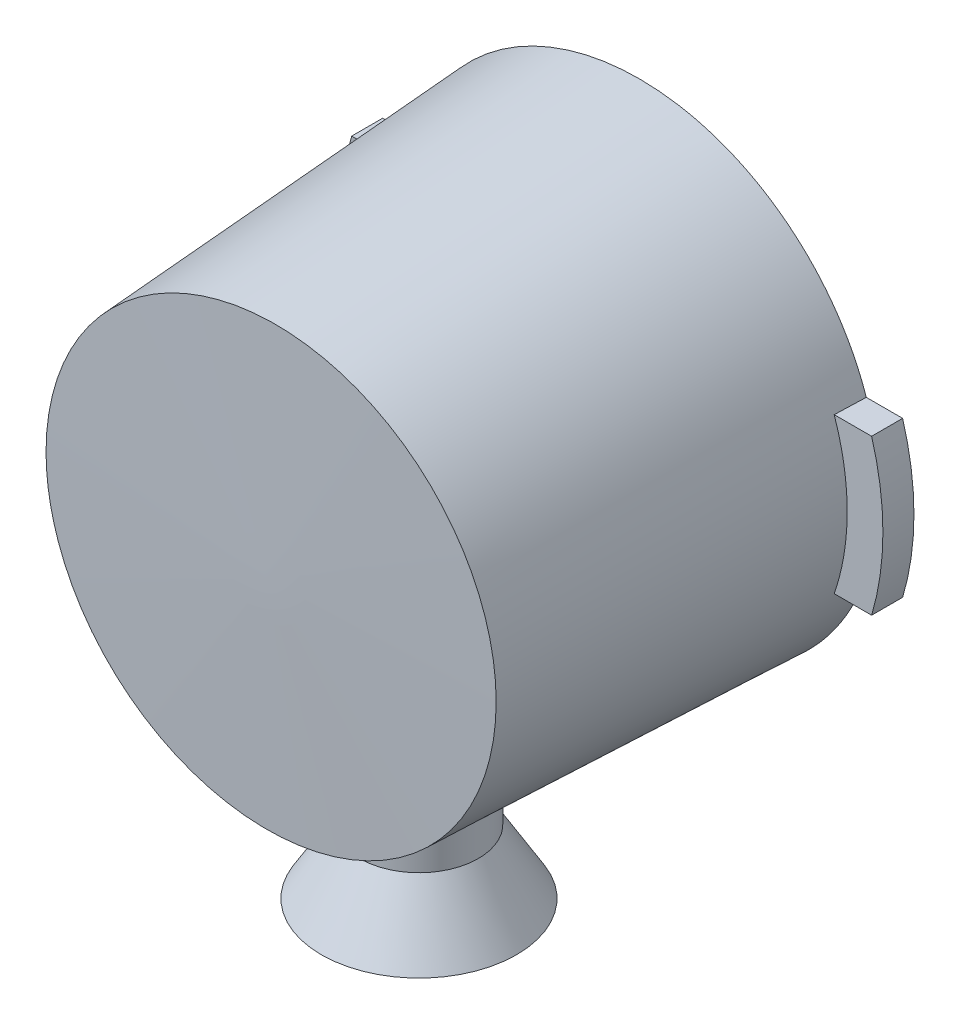
ISO-10303-21;
HEADER;
FILE_DESCRIPTION(('STEP AP214'),'2;1');
FILE_NAME('part.step','',(''),(''),'','','');
FILE_SCHEMA(('AUTOMOTIVE_DESIGN { 1 0 10303 214 1 1 1 1 }'));
ENDSEC;
DATA;
#1=APPLICATION_CONTEXT('core data for automotive mechanical design processes');
#2=APPLICATION_PROTOCOL_DEFINITION('international standard','automotive_design',2000,#1);
#3=PRODUCT_CONTEXT('',#1,'mechanical');
#4=PRODUCT('Part','Part','',(#3));
#5=PRODUCT_RELATED_PRODUCT_CATEGORY('part','',(#4));
#6=PRODUCT_DEFINITION_FORMATION('','',#4);
#7=PRODUCT_DEFINITION_CONTEXT('part definition',#1,'design');
#8=PRODUCT_DEFINITION('design','',#6,#7);
#9=PRODUCT_DEFINITION_SHAPE('','',#8);
#10=(LENGTH_UNIT() NAMED_UNIT(*) SI_UNIT(.MILLI.,.METRE.));
#11=(NAMED_UNIT(*) PLANE_ANGLE_UNIT() SI_UNIT($,.RADIAN.));
#12=(NAMED_UNIT(*) SI_UNIT($,.STERADIAN.) SOLID_ANGLE_UNIT());
#13=UNCERTAINTY_MEASURE_WITH_UNIT(LENGTH_MEASURE(1.E-05),#10,'distance_accuracy_value','');
#14=(GEOMETRIC_REPRESENTATION_CONTEXT(3) GLOBAL_UNCERTAINTY_ASSIGNED_CONTEXT((#13)) GLOBAL_UNIT_ASSIGNED_CONTEXT((#10,
#11,#12)) REPRESENTATION_CONTEXT('',''));
#15=CARTESIAN_POINT('',(0.,0.,0.));
#16=DIRECTION('',(0.,0.,1.));
#17=DIRECTION('',(1.,0.,0.));
#18=AXIS2_PLACEMENT_3D('',#15,#16,#17);
#19=CARTESIAN_POINT('',(-38.2652532564911,97.3127347803037,-30.));
#20=DIRECTION('',(-0.0192423694921687,0.,-0.999814848467619));
#21=DIRECTION('',(-0.999814848467619,0.,0.0192423694921687));
#22=AXIS2_PLACEMENT_3D('',#19,#20,#21);
#23=CONICAL_SURFACE('',#22,31.0057407604144,0.0507242303382606);
#24=CARTESIAN_POINT('',(-43.1975616921221,68.0502223674309,-5.31798709860421));
#25=CARTESIAN_POINT('',(-43.3476559122048,68.0863768443574,-5.16248797121321));
#26=CARTESIAN_POINT('',(-43.4910708525481,68.1229164135615,-5.00072414940561));
#27=CARTESIAN_POINT('',(-43.7637614287514,68.1959529296186,-4.66560617702633));
#28=CARTESIAN_POINT('',(-43.8930355621876,68.2324498715358,-4.49225079802874));
#29=CARTESIAN_POINT('',(-44.1366032660362,68.3045731154494,-4.13501042524083));
#30=CARTESIAN_POINT('',(-44.2508885091045,68.3401989246063,-3.95111965915405));
#31=CARTESIAN_POINT('',(-44.4636002721764,68.40974228143,-3.57407715744918));
#32=CARTESIAN_POINT('',(-44.5620272646143,68.4436598799656,-3.38092569793964));
#33=CARTESIAN_POINT('',(-44.7423917168589,68.5090476295772,-2.98639088805154));
#34=CARTESIAN_POINT('',(-44.8243098932933,68.5405148924885,-2.78499823784278));
#35=CARTESIAN_POINT('',(-44.9708203960348,68.6002270819673,-2.37562310532037));
#36=CARTESIAN_POINT('',(-45.0354191118477,68.6284731946674,-2.16764308497302));
#37=CARTESIAN_POINT('',(-45.1467493587793,68.6811172409305,-1.74649961275038));
#38=CARTESIAN_POINT('',(-45.1934829464917,68.7055156172462,-1.53333676051782));
#39=CARTESIAN_POINT('',(-45.2686313997663,68.7499387173664,-1.10335664188603));
#40=CARTESIAN_POINT('',(-45.2970467577703,68.7699635587332,-0.886539473885118));
#41=CARTESIAN_POINT('',(-45.334788351032,68.8048270552177,-0.456008475943223));
#42=CARTESIAN_POINT('',(-45.3445477446858,68.8197765882963,-0.242341557236111));
#43=CARTESIAN_POINT('',(-45.3461391534778,68.8448936109444,0.185338594559549));
#44=CARTESIAN_POINT('',(-45.3379716085024,68.855061217844,0.399351819021776));
#45=CARTESIAN_POINT('',(-45.3037150081932,68.8705292653003,0.826095321770355));
#46=CARTESIAN_POINT('',(-45.2776276827383,68.8758301755462,1.03882572189419));
#47=CARTESIAN_POINT('',(-45.2077003744026,68.8816347108784,1.4614127160002));
#48=CARTESIAN_POINT('',(-45.163860641589,68.8821384035376,1.67126935042027));
#49=CARTESIAN_POINT('',(-45.0601794662888,68.8786152417328,2.08091071500964));
#50=CARTESIAN_POINT('',(-45.0008027462213,68.8747105206342,2.28081435159024));
#51=CARTESIAN_POINT('',(-44.865968751379,68.8628911178746,2.67507473166624));
#52=CARTESIAN_POINT('',(-44.790506071113,68.8549750870273,2.86942958560419));
#53=CARTESIAN_POINT('',(-44.6240922145605,68.8355703058706,3.25113239615528));
#54=CARTESIAN_POINT('',(-44.5331456994927,68.8240826299039,3.43848244084017));
#55=CARTESIAN_POINT('',(-44.3363672363015,68.7980534955791,3.80505960778879));
#56=CARTESIAN_POINT('',(-44.2305297099742,68.7835108918274,3.98428365261573));
#57=CARTESIAN_POINT('',(-44.0033554288307,68.751775938559,4.33550637368776));
#58=CARTESIAN_POINT('',(-43.8818452090934,68.7345534040669,4.50739011049342));
#59=CARTESIAN_POINT('',(-43.625156786681,68.6982516325851,4.84051142536379));
#60=CARTESIAN_POINT('',(-43.4899738713473,68.6791717554984,5.00174530079931));
#61=CARTESIAN_POINT('',(-43.2068885552165,68.6398586428919,5.3124658011351));
#62=CARTESIAN_POINT('',(-43.0589866588162,68.6196254531196,5.46195289142835));
#63=CARTESIAN_POINT('',(-42.751427476204,68.5787128811359,5.74823536143045));
#64=CARTESIAN_POINT('',(-42.5917700285645,68.5580334928,5.88503056679559));
#65=CARTESIAN_POINT('',(-42.2574913237312,68.5164012588971,6.14838735323836));
#66=CARTESIAN_POINT('',(-42.0825912261364,68.4954550116712,6.27459628602523));
#67=CARTESIAN_POINT('',(-41.722750256455,68.4545661437095,6.51182313290443));
#68=CARTESIAN_POINT('',(-41.5378127966363,68.4346231862866,6.62284616491915));
#69=CARTESIAN_POINT('',(-41.1590277033945,68.3964090971945,6.82900005844691));
#70=CARTESIAN_POINT('',(-40.9651768933617,68.3781385686063,6.92412519728238));
#71=CARTESIAN_POINT('',(-40.5700386290181,68.3439047447432,7.09769765697489));
#72=CARTESIAN_POINT('',(-40.3687541008844,68.3279405535139,7.17615145983699));
#73=CARTESIAN_POINT('',(-39.9603318421571,68.2988680305629,7.3157426011096));
#74=CARTESIAN_POINT('',(-39.753201328426,68.2857563378802,7.37690034440822));
#75=CARTESIAN_POINT('',(-39.3344193101816,68.2628113809616,7.48151630753391));
#76=CARTESIAN_POINT('',(-39.1227695182375,68.2529768974986,7.52498111103943));
#77=CARTESIAN_POINT('',(-38.6964049783504,68.2369110918259,7.59388803968991));
#78=CARTESIAN_POINT('',(-38.4816900275132,68.2306800092826,7.61932896607153));
#79=CARTESIAN_POINT('',(-38.0508027338904,68.2220329836281,7.65196673746108));
#80=CARTESIAN_POINT('',(-37.8346304151132,68.2196169778217,7.65916388227977));
#81=CARTESIAN_POINT('',(-37.4068008823604,68.2186908505052,7.65529014790767));
#82=CARTESIAN_POINT('',(-37.1951404392137,68.2201030251103,7.64458435877857));
#83=CARTESIAN_POINT('',(-36.7734172261189,68.2266232870832,7.60567246715395));
#84=CARTESIAN_POINT('',(-36.5633550358706,68.2317326563841,7.57746029513126));
#85=CARTESIAN_POINT('',(-36.1464823362595,68.2454800913692,7.50376750731049));
#86=CARTESIAN_POINT('',(-35.9396706415396,68.2541168381916,7.45829334609741));
#87=CARTESIAN_POINT('',(-35.5305969872041,68.2746426306957,7.35041113072798));
#88=CARTESIAN_POINT('',(-35.3283367476782,68.2865328843258,7.28799678716087));
#89=CARTESIAN_POINT('',(-34.9303077408889,68.3131479196079,7.14688287788538));
#90=CARTESIAN_POINT('',(-34.7345249445024,68.3278660311944,7.06822160168942));
#91=CARTESIAN_POINT('',(-34.3502091330579,68.3596855344,6.89507446074772));
#92=CARTESIAN_POINT('',(-34.1616786343497,68.3767877438868,6.80058316323877));
#93=CARTESIAN_POINT('',(-33.7931938997527,68.4128176128591,6.59647228478521));
#94=CARTESIAN_POINT('',(-33.6132391205987,68.4317451564808,6.48685366386344));
#95=CARTESIAN_POINT('',(-33.2630587729614,68.4708109932584,6.25323384640161));
#96=CARTESIAN_POINT('',(-33.0928333748887,68.4909493076082,6.12923239806085));
#97=CARTESIAN_POINT('',(-32.7599697150213,68.5321744910528,5.86510017826732));
#98=CARTESIAN_POINT('',(-32.5975461413467,68.553272221993,5.72470044548413));
#99=CARTESIAN_POINT('',(-32.285097431472,68.5952926008116,5.43080184009385));
#100=CARTESIAN_POINT('',(-32.1350681772279,68.61621530475,5.27730735298587));
#101=CARTESIAN_POINT('',(-31.8483025631672,68.6571495578354,4.95813145418718));
#102=CARTESIAN_POINT('',(-31.7115719057724,68.6771607141737,4.79244486756339));
#103=CARTESIAN_POINT('',(-31.4524763073744,68.715505577453,4.45011167030625));
#104=CARTESIAN_POINT('',(-31.3301059265381,68.7338399190056,4.27346924887723));
#105=CARTESIAN_POINT('',(-31.0997472864259,68.7682353516796,3.90908962247473));
#106=CARTESIAN_POINT('',(-30.9918651704984,68.7842797146047,3.72128369240298));
#107=CARTESIAN_POINT('',(-30.7923460980697,68.8132462816858,3.33708618403918));
#108=CARTESIAN_POINT('',(-30.7007031673687,68.8261696346612,3.14069779641463));
#109=CARTESIAN_POINT('',(-30.5343257808353,68.84828615359,2.74067261677561));
#110=CARTESIAN_POINT('',(-30.4595917101446,68.8574792345809,2.53703565977903));
#111=CARTESIAN_POINT('',(-30.3276336604829,68.8716174721845,2.12402199464146));
#112=CARTESIAN_POINT('',(-30.2704092558246,68.8765627320737,1.91464542617422));
#113=CARTESIAN_POINT('',(-30.1750513882501,68.8817507650831,1.49665844229931));
#114=CARTESIAN_POINT('',(-30.1365047135057,68.8821002742403,1.28814354832554));
#115=CARTESIAN_POINT('',(-30.076837144022,68.8781356461406,0.868680047253064));
#116=CARTESIAN_POINT('',(-30.0557159637289,68.8738215853088,0.657731480092717));
#117=CARTESIAN_POINT('',(-30.0310323645045,68.8604358838887,0.234981489385615));
#118=CARTESIAN_POINT('',(-30.0274682440818,68.8513647044169,0.0231801504738729));
#119=CARTESIAN_POINT('',(-30.0378697775356,68.8285166834762,-0.399735052260718));
#120=CARTESIAN_POINT('',(-30.0518353379565,68.8147398670947,-0.610848919742649));
#121=CARTESIAN_POINT('',(-30.0967357560713,68.7829474008233,-1.02730365438928));
#122=CARTESIAN_POINT('',(-30.1273797080148,68.7650073586795,-1.2326817783956));
#123=CARTESIAN_POINT('',(-30.2051515881901,68.725072967581,-1.63996158004305));
#124=CARTESIAN_POINT('',(-30.2522850811307,68.7030772511485,-1.84186205992304));
#125=CARTESIAN_POINT('',(-30.3626060091724,68.6554636806047,-2.24072944351625));
#126=CARTESIAN_POINT('',(-30.4257893032864,68.6298467615498,-2.43769760543105));
#127=CARTESIAN_POINT('',(-30.5677329079455,68.575491409583,-2.82557451192926));
#128=CARTESIAN_POINT('',(-30.6464990866844,68.5467518025746,-3.01648094226301));
#129=CARTESIAN_POINT('',(-30.8209121362031,68.4860864316738,-3.3951212900775));
#130=CARTESIAN_POINT('',(-30.9168930802287,68.4541043647832,-3.58269230448817));
#131=CARTESIAN_POINT('',(-31.1238412649639,68.3881838345387,-3.94909819729072));
#132=CARTESIAN_POINT('',(-31.2348136930345,68.3542446963381,-4.12793002244671));
#133=CARTESIAN_POINT('',(-31.4709726453418,68.285154214617,-4.47570480242122));
#134=CARTESIAN_POINT('',(-31.5961594994708,68.2500028429759,-4.64464752759286));
#135=CARTESIAN_POINT('',(-31.8599444160851,68.1792501281955,-4.97161730945048));
#136=CARTESIAN_POINT('',(-31.9985427180217,68.1436487770319,-5.12964417115559));
#137=CARTESIAN_POINT('',(-32.2932204731974,68.071565492104,-5.43897921052234));
#138=CARTESIAN_POINT('',(-32.449733646118,68.0350946935953,-5.58987718271458));
#139=CARTESIAN_POINT('',(-32.7751210998747,67.9633639077339,-5.87789677943359));
#140=CARTESIAN_POINT('',(-32.9439911867907,67.9281035154853,-6.01502304091648));
#141=CARTESIAN_POINT('',(-33.2931248564183,67.8595996957234,-6.27464272347823));
#142=CARTESIAN_POINT('',(-33.4733929510765,67.8263570772894,-6.39713029361644));
#143=CARTESIAN_POINT('',(-33.8440071673989,67.7627164601847,-6.62644500466807));
#144=CARTESIAN_POINT('',(-34.0343491554348,67.7323173087065,-6.73327850214539));
#145=CARTESIAN_POINT('',(-34.4232089689398,67.6751946261864,-6.93014491057441));
#146=CARTESIAN_POINT('',(-34.6216956714199,67.6484585388466,-7.02023561164173));
#147=CARTESIAN_POINT('',(-35.0260068461054,67.5992118793903,-7.18328475874248));
#148=CARTESIAN_POINT('',(-35.2318284177785,67.5766996585566,-7.25624989226378));
#149=CARTESIAN_POINT('',(-35.6493740150257,67.5364625379008,-7.38443186652698));
#150=CARTESIAN_POINT('',(-35.8610977101947,67.5187373706873,-7.43964969861615));
#151=CARTESIAN_POINT('',(-36.2888517485802,67.4885345837388,-7.53181423876584));
#152=CARTESIAN_POINT('',(-36.5048819312884,67.4760567688096,-7.56876162647024));
#153=CARTESIAN_POINT('',(-36.9310700968726,67.4570561009123,-7.6229393850112));
#154=CARTESIAN_POINT('',(-37.1411281394656,67.4503198135213,-7.64088309589348));
#155=CARTESIAN_POINT('',(-37.5621097754258,67.4421626420316,-7.65938656858462));
#156=CARTESIAN_POINT('',(-37.7730333469589,67.4407416246626,-7.65994676625526));
#157=CARTESIAN_POINT('',(-38.1941682907171,67.4432501977897,-7.64367080058354));
#158=CARTESIAN_POINT('',(-38.404379685228,67.447179619277,-7.62683518674165));
#159=CARTESIAN_POINT('',(-38.8225346190113,67.460291220989,-7.57591843710904));
#160=CARTESIAN_POINT('',(-39.0304781844059,67.4694733406447,-7.54183750017482));
#161=CARTESIAN_POINT('',(-39.4380601526195,67.4926075177461,-7.45766948582019));
#162=CARTESIAN_POINT('',(-39.6377807004336,67.5064506695178,-7.407949424444));
#163=CARTESIAN_POINT('',(-40.0323095360319,67.5386288429966,-7.2927026564119));
#164=CARTESIAN_POINT('',(-40.2271160473062,67.5569654642127,-7.22717032129864));
#165=CARTESIAN_POINT('',(-40.6103420747165,67.5976979726811,-7.08087899860813));
#166=CARTESIAN_POINT('',(-40.7987657339915,67.6200911644496,-7.00013012059574));
#167=CARTESIAN_POINT('',(-41.168188788874,67.6684431192013,-6.82399933095711));
#168=CARTESIAN_POINT('',(-41.349186171057,67.6944028409602,-6.72861348372503));
#169=CARTESIAN_POINT('',(-41.8338174878166,67.7697173794929,-6.44788704970055));
#170=CARTESIAN_POINT('',(-42.1288627029174,67.8221456666475,-6.24829287613281));
#171=CARTESIAN_POINT('',(-42.6877725282339,67.9327782923332,-5.81073781749432));
#172=CARTESIAN_POINT('',(-42.9516329365562,67.9909834073044,-5.57277177232323));
#173=CARTESIAN_POINT('',(-43.1975616921221,68.0502223674309,-5.31798709860421));
#174=B_SPLINE_CURVE_WITH_KNOTS('',3,(#24,#25,#26,#27,#28,#29,#30,#31,#32,#33,#34,#35,#36,#37,
#38,#39,#40,#41,#42,#43,#44,#45,#46,#47,#48,#49,#50,#51,#52,#53,#54,#55,#56,#57,#58,#59,#60,#61,
#62,#63,#64,#65,#66,#67,#68,#69,#70,#71,#72,#73,#74,#75,#76,#77,#78,#79,#80,#81,#82,#83,#84,#85,
#86,#87,#88,#89,#90,#91,#92,#93,#94,#95,#96,#97,#98,#99,#100,#101,#102,#103,#104,#105,#106,#107,
#108,#109,#110,#111,#112,#113,#114,#115,#116,#117,#118,#119,#120,#121,#122,#123,#124,#125,#126,
#127,#128,#129,#130,#131,#132,#133,#134,#135,#136,#137,#138,#139,#140,#141,#142,#143,#144,#145,
#146,#147,#148,#149,#150,#151,#152,#153,#154,#155,#156,#157,#158,#159,#160,#161,#162,#163,#164,
#165,#166,#167,#168,#169,#170,#171,#172,#173),.UNSPECIFIED.,.T.,.F.,(4,2,2,2,2,2,2,2,2,2,2,2,2,
2,2,2,2,2,2,2,2,2,2,2,2,2,2,2,2,2,2,2,2,2,2,2,2,2,2,2,2,2,2,2,2,2,2,2,2,2,2,2,2,2,2,2,2,2,2,2,2,
2,2,2,2,2,2,2,2,2,2,2,2,2,4),(0.,0.657068654856956,1.31420705386948,1.97170900508056,
2.62919136497647,3.28743731174769,3.94544008283,4.60336708327309,5.26127639618869,
5.90371533867051,6.54613851733387,7.18849968864715,7.83085181173467,8.45583535364166,
9.08102924567424,9.70603526245995,10.3312760342766,10.9641509007254,11.5972446525783,
12.2303133093874,12.8633906611395,13.5127121414398,14.1618142466491,14.8111495046698,
15.4602318299309,16.1085451804008,16.7566170674937,17.4047320536327,18.0528363888495,
18.6878846092148,19.3231531262397,19.9581843379347,20.5934516420407,21.2272385394124,
21.8612433957069,22.495208034743,23.1291837742975,23.7756114986545,24.4218235746677,
25.0683115351451,25.7145538027856,26.3652985753046,27.0158034474115,27.6663231349071,
28.3168270059985,28.9521955438732,29.5875536696775,30.22285022039,30.8581433841772,
31.4826951426046,32.1074578715218,32.7320595697095,33.3568969293173,33.9955189578536,
34.6343625314368,35.2732209345078,35.9120907460183,36.5726488691381,37.2329838303789,
37.893581844522,38.553910865403,39.211916525463,39.8696648069929,40.5273763409451,
41.1850634067864,41.8170782761125,42.449077298737,43.0810563583293,43.7130281307125,
44.3311548093787,44.9495018387352,45.5674394899836,46.1855435851326,47.2620029652661,
48.338607224387),.UNSPECIFIED.);
#175=CARTESIAN_POINT('',(-43.1975616921221,68.0502223674309,-5.31798709860421));
#176=VERTEX_POINT('',#175);
#177=EDGE_CURVE('E231',#176,#176,#174,.T.);
#178=ORIENTED_EDGE('',*,*,#177,.T.);
#179=EDGE_LOOP('',(#178));
#180=FACE_BOUND('',#179,.T.);
#181=CARTESIAN_POINT('',(-37.3135092715189,97.3127347803037,19.4516940079678));
#182=DIRECTION('',(0.0192423694921687,0.,0.999814848467619));
#183=DIRECTION('',(0.999814848467619,0.,-0.0192423694921687));
#184=AXIS2_PLACEMENT_3D('',#181,#182,#183);
#185=CIRCLE('',#184,28.4947231813271);
#186=CARTESIAN_POINT('',(-8.82406193185354,97.3127347803037,18.9033880159357));
#187=VERTEX_POINT('',#186);
#188=EDGE_CURVE('E235',#187,#187,#185,.T.);
#189=ORIENTED_EDGE('',*,*,#188,.F.);
#190=EDGE_LOOP('',(#189));
#191=FACE_BOUND('',#190,.T.);
#192=CARTESIAN_POINT('',(-68.0594097844042,87.3127347803037,-35.6160112483382));
#193=CARTESIAN_POINT('',(-67.8622120602491,87.3127347803037,-32.9106576784328));
#194=CARTESIAN_POINT('',(-67.6649013724154,87.3127347803037,-30.2053123521218));
#195=CARTESIAN_POINT('',(-67.2700540693818,87.3127347803037,-24.794638186563));
#196=CARTESIAN_POINT('',(-67.0725174541819,87.3127347803037,-22.0893093473152));
#197=CARTESIAN_POINT('',(-66.8748678753036,87.3127347803037,-19.3839887516618));
#198=B_SPLINE_CURVE_WITH_KNOTS('',3,(#192,#193,#194,#195,#196,#197),.UNSPECIFIED.,.F.,.F.,(4,2,
4),(0.,8.13759323013462,16.275186460648),.UNSPECIFIED.);
#199=CARTESIAN_POINT('',(-67.5772067831565,87.3127347803037,-29.0037879800981));
#200=VERTEX_POINT('',#199);
#201=CARTESIAN_POINT('',(-67.2850095711377,87.3127347803037,-25.));
#202=VERTEX_POINT('',#201);
#203=EDGE_CURVE('E63',#200,#202,#198,.T.);
#204=ORIENTED_EDGE('',*,*,#203,.F.);
#205=CARTESIAN_POINT('',(-38.2763313119301,97.3127347803037,-29.0037879800981));
#206=DIRECTION('',(0.,0.,1.));
#207=DIRECTION('',(-1.,0.,0.));
#208=AXIS2_PLACEMENT_3D('',#205,#206,#207);
#209=ELLIPSE('',#208,30.9609179365911,30.9551706991607);
#210=CARTESIAN_POINT('',(-8.9754558407038,87.3127347803037,-29.0037879800981));
#211=VERTEX_POINT('',#210);
#212=EDGE_CURVE('E129',#200,#211,#209,.T.);
#213=ORIENTED_EDGE('',*,*,#212,.T.);
#214=CARTESIAN_POINT('',(-8.74936938309626,87.3127347803037,-35.5885053278759));
#215=CARTESIAN_POINT('',(-8.84185047530339,87.3127347803037,-32.8923291375612));
#216=CARTESIAN_POINT('',(-8.93444423093017,87.3127347803037,-30.1961568211226));
#217=CARTESIAN_POINT('',(-9.11985706902732,87.3127347803037,-24.803819935872));
#218=CARTESIAN_POINT('',(-9.21267615149771,87.3127347803037,-22.10765536706));
#219=CARTESIAN_POINT('',(-9.30560789738776,87.3127347803037,-19.4114946721241));
#220=B_SPLINE_CURVE_WITH_KNOTS('',3,(#214,#215,#216,#217,#218,#219),.UNSPECIFIED.,.F.,.F.,(4,2,
4),(0.,8.09328541888907,16.186570838154),.UNSPECIFIED.);
#221=CARTESIAN_POINT('',(-9.1131424290339,87.3127347803037,-25.));
#222=VERTEX_POINT('',#221);
#223=EDGE_CURVE('E201',#211,#222,#220,.T.);
#224=ORIENTED_EDGE('',*,*,#223,.T.);
#225=CARTESIAN_POINT('',(-38.1990760000858,97.3127347803037,-25.));
#226=DIRECTION('',(0.,0.,1.));
#227=DIRECTION('',(-1.,0.,0.));
#228=AXIS2_PLACEMENT_3D('',#225,#226,#227);
#229=ELLIPSE('',#228,30.7575790301457,30.7518695382685);
#230=CARTESIAN_POINT('',(-9.1131424290339,107.312734780304,-25.));
#231=VERTEX_POINT('',#230);
#232=EDGE_CURVE('E202',#222,#231,#229,.T.);
#233=ORIENTED_EDGE('',*,*,#232,.T.);
#234=CARTESIAN_POINT('',(-9.30560789738776,107.312734780304,-19.4114946721241));
#235=CARTESIAN_POINT('',(-9.21267615149771,107.312734780304,-22.10765536706));
#236=CARTESIAN_POINT('',(-9.11985706902732,107.312734780304,-24.803819935872));
#237=CARTESIAN_POINT('',(-8.93444423093017,107.312734780304,-30.1961568211226));
#238=CARTESIAN_POINT('',(-8.84185047530339,107.312734780304,-32.8923291375612));
#239=CARTESIAN_POINT('',(-8.74936938309626,107.312734780304,-35.5885053278759));
#240=B_SPLINE_CURVE_WITH_KNOTS('',3,(#234,#235,#236,#237,#238,#239),.UNSPECIFIED.,.F.,.F.,(4,2,
4),(0.,8.09328541926497,16.186570838154),.UNSPECIFIED.);
#241=CARTESIAN_POINT('',(-8.9754558407038,107.312734780304,-29.0037879800981));
#242=VERTEX_POINT('',#241);
#243=EDGE_CURVE('E193',#231,#242,#240,.T.);
#244=ORIENTED_EDGE('',*,*,#243,.T.);
#245=CARTESIAN_POINT('',(-67.5772067831565,107.312734780304,-29.0037879800981));
#246=VERTEX_POINT('',#245);
#247=EDGE_CURVE('E126',#242,#246,#209,.T.);
#248=ORIENTED_EDGE('',*,*,#247,.T.);
#249=CARTESIAN_POINT('',(-68.0594097844042,107.312734780304,-35.6160112483382));
#250=CARTESIAN_POINT('',(-67.8622120602491,107.312734780304,-32.9106576784328));
#251=CARTESIAN_POINT('',(-67.6649013724154,107.312734780304,-30.2053123521218));
#252=CARTESIAN_POINT('',(-67.2700540693818,107.312734780304,-24.794638186563));
#253=CARTESIAN_POINT('',(-67.0725174541819,107.312734780304,-22.0893093473152));
#254=CARTESIAN_POINT('',(-66.8748678753036,107.312734780304,-19.3839887516618));
#255=B_SPLINE_CURVE_WITH_KNOTS('',3,(#249,#250,#251,#252,#253,#254),.UNSPECIFIED.,.F.,.F.,(4,2,
4),(0.,8.13759323013462,16.275186460648),.UNSPECIFIED.);
#256=CARTESIAN_POINT('',(-67.2850095711377,107.312734780304,-25.));
#257=VERTEX_POINT('',#256);
#258=EDGE_CURVE('E155',#246,#257,#255,.T.);
#259=ORIENTED_EDGE('',*,*,#258,.T.);
#260=CARTESIAN_POINT('',(-38.1990760000858,97.3127347803037,-25.));
#261=DIRECTION('',(0.,0.,1.));
#262=DIRECTION('',(-1.,0.,0.));
#263=AXIS2_PLACEMENT_3D('',#260,#261,#262);
#264=ELLIPSE('',#263,30.7575790301457,30.7518695382685);
#265=EDGE_CURVE('E50',#257,#202,#264,.T.);
#266=ORIENTED_EDGE('',*,*,#265,.T.);
#267=EDGE_LOOP('',(#204,#213,#224,#233,#244,#248,#259,#266));
#268=FACE_BOUND('',#267,.T.);
#269=ADVANCED_FACE('F41',(#180,#191,#268),#23,.T.);
#270=CARTESIAN_POINT('',(-37.687875269307,51.4712591352582,0.));
#271=DIRECTION('',(0.,-1.,0.));
#272=DIRECTION('',(0.,0.,-1.));
#273=AXIS2_PLACEMENT_3D('',#270,#271,#272);
#274=CYLINDRICAL_SURFACE('',#273,7.65752122156146);
#275=CARTESIAN_POINT('',(-37.687875269307,59.7526574916391,0.));
#276=DIRECTION('',(0.,-1.,0.));
#277=DIRECTION('',(0.,0.,-1.));
#278=AXIS2_PLACEMENT_3D('',#275,#276,#277);
#279=CIRCLE('',#278,7.65752122156146);
#280=CARTESIAN_POINT('',(-37.687875269307,59.7526574916391,-7.65752122156146));
#281=VERTEX_POINT('',#280);
#282=EDGE_CURVE('E264',#281,#281,#279,.T.);
#283=ORIENTED_EDGE('',*,*,#282,.F.);
#284=EDGE_LOOP('',(#283));
#285=FACE_BOUND('',#284,.T.);
#286=ORIENTED_EDGE('',*,*,#177,.F.);
#287=EDGE_LOOP('',(#286));
#288=FACE_BOUND('',#287,.T.);
#289=ADVANCED_FACE('F222',(#285,#288),#274,.T.);
#290=CARTESIAN_POINT('',(-50.28554931895,51.4712591352582,0.));
#291=DIRECTION('',(0.,1.,0.));
#292=DIRECTION('',(0.,0.,1.));
#293=AXIS2_PLACEMENT_3D('',#290,#291,#292);
#294=PLANE('',#293);
#295=CARTESIAN_POINT('',(-37.687875269307,51.4712591352582,0.));
#296=DIRECTION('',(0.,-1.,0.));
#297=DIRECTION('',(0.,0.,-1.));
#298=AXIS2_PLACEMENT_3D('',#295,#296,#297);
#299=CIRCLE('',#298,12.597674049643);
#300=CARTESIAN_POINT('',(-37.687875269307,51.4712591352582,-12.597674049643));
#301=VERTEX_POINT('',#300);
#302=EDGE_CURVE('E267',#301,#301,#299,.T.);
#303=ORIENTED_EDGE('',*,*,#302,.T.);
#304=EDGE_LOOP('',(#303));
#305=FACE_BOUND('',#304,.T.);
#306=ADVANCED_FACE('F43',(#305),#294,.F.);
#307=CARTESIAN_POINT('',(-37.687875269307,59.7526574916391,0.));
#308=DIRECTION('',(0.,-1.,0.));
#309=DIRECTION('',(0.,0.,-1.));
#310=AXIS2_PLACEMENT_3D('',#307,#308,#309);
#311=CONICAL_SURFACE('',#310,7.65752122156146,0.537868600008348);
#312=ORIENTED_EDGE('',*,*,#302,.F.);
#313=EDGE_LOOP('',(#312));
#314=FACE_BOUND('',#313,.T.);
#315=ORIENTED_EDGE('',*,*,#282,.T.);
#316=EDGE_LOOP('',(#315));
#317=FACE_BOUND('',#316,.T.);
#318=ADVANCED_FACE('F214',(#314,#317),#311,.T.);
#319=CARTESIAN_POINT('',(-37.3135092715189,97.3127347803037,19.4516940079678));
#320=DIRECTION('',(-0.0192423694921687,0.,-0.999814848467619));
#321=DIRECTION('',(-0.999814848467619,0.,0.0192423694921687));
#322=AXIS2_PLACEMENT_3D('',#319,#320,#321);
#323=CONICAL_SURFACE('',#322,28.4947231813271,1.55155276963004);
#324=CARTESIAN_POINT('',(-37.3029566111842,97.3127347803037,20.));
#325=VERTEX_POINT('',#324);
#326=VERTEX_LOOP('',#325);
#327=FACE_BOUND('',#326,.T.);
#328=ORIENTED_EDGE('',*,*,#188,.T.);
#329=EDGE_LOOP('',(#328));
#330=FACE_BOUND('',#329,.T.);
#331=ADVANCED_FACE('F211',(#327,#330),#323,.T.);
#332=CARTESIAN_POINT('',(0.,87.3127347803037,-30.));
#333=DIRECTION('',(0.,-1.,0.));
#334=DIRECTION('',(0.,0.,-1.));
#335=AXIS2_PLACEMENT_3D('',#332,#333,#334);
#336=PLANE('',#335);
#337=DIRECTION('',(-1.,0.,0.));
#338=VECTOR('',#337,1.);
#339=CARTESIAN_POINT('',(0.,87.3127347803037,-29.0037879800981));
#340=LINE('',#339,#338);
#341=CARTESIAN_POINT('',(-4.286962272009,87.3127347803037,-29.0037879800981));
#342=VERTEX_POINT('',#341);
#343=EDGE_CURVE('E132',#342,#211,#340,.T.);
#344=ORIENTED_EDGE('',*,*,#343,.F.);
#345=DIRECTION('',(0.,0.,1.));
#346=VECTOR('',#345,1.);
#347=CARTESIAN_POINT('',(-4.286962272009,87.3127347803037,-30.));
#348=LINE('',#347,#346);
#349=CARTESIAN_POINT('',(-4.286962272009,87.3127347803037,-25.));
#350=VERTEX_POINT('',#349);
#351=EDGE_CURVE('E259',#342,#350,#348,.T.);
#352=ORIENTED_EDGE('',*,*,#351,.T.);
#353=DIRECTION('',(1.,0.,0.));
#354=VECTOR('',#353,1.);
#355=CARTESIAN_POINT('',(0.,87.3127347803037,-25.));
#356=LINE('',#355,#354);
#357=EDGE_CURVE('E248',#222,#350,#356,.T.);
#358=ORIENTED_EDGE('',*,*,#357,.F.);
#359=ORIENTED_EDGE('',*,*,#223,.F.);
#360=EDGE_LOOP('',(#344,#352,#358,#359));
#361=FACE_BOUND('',#360,.T.);
#362=ADVANCED_FACE('F189',(#361),#336,.T.);
#363=CARTESIAN_POINT('',(0.,107.312734780304,-30.));
#364=DIRECTION('',(0.,1.,0.));
#365=DIRECTION('',(0.,0.,1.));
#366=AXIS2_PLACEMENT_3D('',#363,#364,#365);
#367=PLANE('',#366);
#368=DIRECTION('',(1.,0.,0.));
#369=VECTOR('',#368,1.);
#370=CARTESIAN_POINT('',(0.,107.312734780304,-29.0037879800981));
#371=LINE('',#370,#369);
#372=CARTESIAN_POINT('',(-4.286962272009,107.312734780304,-29.0037879800981));
#373=VERTEX_POINT('',#372);
#374=EDGE_CURVE('E130',#242,#373,#371,.T.);
#375=ORIENTED_EDGE('',*,*,#374,.F.);
#376=ORIENTED_EDGE('',*,*,#243,.F.);
#377=DIRECTION('',(-1.,0.,0.));
#378=VECTOR('',#377,1.);
#379=CARTESIAN_POINT('',(0.,107.312734780304,-25.));
#380=LINE('',#379,#378);
#381=CARTESIAN_POINT('',(-4.286962272009,107.312734780304,-25.));
#382=VERTEX_POINT('',#381);
#383=EDGE_CURVE('E255',#382,#231,#380,.T.);
#384=ORIENTED_EDGE('',*,*,#383,.F.);
#385=DIRECTION('',(0.,0.,1.));
#386=VECTOR('',#385,1.);
#387=CARTESIAN_POINT('',(-4.286962272009,107.312734780304,-30.));
#388=LINE('',#387,#386);
#389=EDGE_CURVE('E260',#373,#382,#388,.T.);
#390=ORIENTED_EDGE('',*,*,#389,.F.);
#391=EDGE_LOOP('',(#375,#376,#384,#390));
#392=FACE_BOUND('',#391,.T.);
#393=ADVANCED_FACE('F185',(#392),#367,.T.);
#394=CARTESIAN_POINT('',(-37.8279819345058,97.3127347803037,-30.));
#395=DIRECTION('',(0.,0.,1.));
#396=DIRECTION('',(1.,0.,0.));
#397=AXIS2_PLACEMENT_3D('',#394,#395,#396);
#398=CYLINDRICAL_SURFACE('',#397,35.);
#399=CARTESIAN_POINT('',(-37.8279819345058,97.3127347803037,-29.0037879800981));
#400=DIRECTION('',(0.,0.,1.));
#401=DIRECTION('',(1.,0.,0.));
#402=AXIS2_PLACEMENT_3D('',#399,#400,#401);
#403=CIRCLE('',#402,35.);
#404=EDGE_CURVE('E134',#373,#342,#403,.F.);
#405=ORIENTED_EDGE('',*,*,#404,.F.);
#406=ORIENTED_EDGE('',*,*,#389,.T.);
#407=CARTESIAN_POINT('',(-37.8279819345058,97.3127347803037,-25.));
#408=DIRECTION('',(0.,0.,1.));
#409=DIRECTION('',(1.,0.,0.));
#410=AXIS2_PLACEMENT_3D('',#407,#408,#409);
#411=CIRCLE('',#410,35.);
#412=EDGE_CURVE('E250',#350,#382,#411,.T.);
#413=ORIENTED_EDGE('',*,*,#412,.F.);
#414=ORIENTED_EDGE('',*,*,#351,.F.);
#415=EDGE_LOOP('',(#405,#406,#413,#414));
#416=FACE_BOUND('',#415,.T.);
#417=ADVANCED_FACE('F183',(#416),#398,.T.);
#418=CARTESIAN_POINT('',(0.,0.,-25.));
#419=DIRECTION('',(0.,0.,1.));
#420=DIRECTION('',(1.,0.,0.));
#421=AXIS2_PLACEMENT_3D('',#418,#419,#420);
#422=PLANE('',#421);
#423=ORIENTED_EDGE('',*,*,#232,.F.);
#424=ORIENTED_EDGE('',*,*,#357,.T.);
#425=ORIENTED_EDGE('',*,*,#412,.T.);
#426=ORIENTED_EDGE('',*,*,#383,.T.);
#427=EDGE_LOOP('',(#423,#424,#425,#426));
#428=FACE_BOUND('',#427,.T.);
#429=ADVANCED_FACE('F179',(#428),#422,.T.);
#430=CARTESIAN_POINT('',(0.,107.312734780304,-30.));
#431=DIRECTION('',(0.,1.,0.));
#432=DIRECTION('',(0.,0.,1.));
#433=AXIS2_PLACEMENT_3D('',#430,#431,#432);
#434=PLANE('',#433);
#435=DIRECTION('',(1.,0.,0.));
#436=VECTOR('',#435,1.);
#437=CARTESIAN_POINT('',(0.,107.312734780304,-29.0037879800981));
#438=LINE('',#437,#436);
#439=CARTESIAN_POINT('',(-71.3690015970027,107.312734780304,-29.0037879800981));
#440=VERTEX_POINT('',#439);
#441=EDGE_CURVE('E124',#440,#246,#438,.T.);
#442=ORIENTED_EDGE('',*,*,#441,.F.);
#443=DIRECTION('',(0.,0.,1.));
#444=VECTOR('',#443,1.);
#445=CARTESIAN_POINT('',(-71.3690015970027,107.312734780304,-30.));
#446=LINE('',#445,#444);
#447=CARTESIAN_POINT('',(-71.3690015970027,107.312734780304,-25.));
#448=VERTEX_POINT('',#447);
#449=EDGE_CURVE('E144',#440,#448,#446,.T.);
#450=ORIENTED_EDGE('',*,*,#449,.T.);
#451=DIRECTION('',(-1.,0.,0.));
#452=VECTOR('',#451,1.);
#453=CARTESIAN_POINT('',(0.,107.312734780304,-25.));
#454=LINE('',#453,#452);
#455=EDGE_CURVE('E136',#257,#448,#454,.T.);
#456=ORIENTED_EDGE('',*,*,#455,.F.);
#457=ORIENTED_EDGE('',*,*,#258,.F.);
#458=EDGE_LOOP('',(#442,#450,#456,#457));
#459=FACE_BOUND('',#458,.T.);
#460=ADVANCED_FACE('F171',(#459),#434,.T.);
#461=CARTESIAN_POINT('',(2.59991301093034E-13,87.3127347803035,-30.));
#462=DIRECTION('',(0.,1.,0.));
#463=DIRECTION('',(-1.,0.,0.));
#464=AXIS2_PLACEMENT_3D('',#461,#462,#463);
#465=PLANE('',#464);
#466=DIRECTION('',(0.,0.,1.));
#467=VECTOR('',#466,1.);
#468=CARTESIAN_POINT('',(-71.3690015970027,87.3127347803037,-30.));
#469=LINE('',#468,#467);
#470=CARTESIAN_POINT('',(-71.3690015970027,87.3127347803037,-29.0037879800981));
#471=VERTEX_POINT('',#470);
#472=CARTESIAN_POINT('',(-71.3690015970027,87.3127347803037,-25.));
#473=VERTEX_POINT('',#472);
#474=EDGE_CURVE('E145',#471,#473,#469,.T.);
#475=ORIENTED_EDGE('',*,*,#474,.F.);
#476=DIRECTION('',(1.,0.,0.));
#477=VECTOR('',#476,1.);
#478=CARTESIAN_POINT('',(2.59991301093034E-13,87.3127347803035,-29.0037879800981));
#479=LINE('',#478,#477);
#480=EDGE_CURVE('E56',#471,#200,#479,.T.);
#481=ORIENTED_EDGE('',*,*,#480,.T.);
#482=ORIENTED_EDGE('',*,*,#203,.T.);
#483=DIRECTION('',(-1.,0.,0.));
#484=VECTOR('',#483,1.);
#485=CARTESIAN_POINT('',(2.59991301093034E-13,87.3127347803035,-25.));
#486=LINE('',#485,#484);
#487=EDGE_CURVE('E142',#202,#473,#486,.T.);
#488=ORIENTED_EDGE('',*,*,#487,.T.);
#489=EDGE_LOOP('',(#475,#481,#482,#488));
#490=FACE_BOUND('',#489,.T.);
#491=ADVANCED_FACE('F165',(#490),#465,.F.);
#492=CARTESIAN_POINT('',(-37.8279819345058,97.3127347803037,-30.));
#493=DIRECTION('',(0.,0.,1.));
#494=DIRECTION('',(1.,0.,0.));
#495=AXIS2_PLACEMENT_3D('',#492,#493,#494);
#496=CYLINDRICAL_SURFACE('',#495,35.);
#497=CARTESIAN_POINT('',(-37.8279819345058,97.3127347803037,-29.0037879800981));
#498=DIRECTION('',(0.,0.,1.));
#499=DIRECTION('',(1.,0.,0.));
#500=AXIS2_PLACEMENT_3D('',#497,#498,#499);
#501=CIRCLE('',#500,35.);
#502=EDGE_CURVE('E11',#471,#440,#501,.F.);
#503=ORIENTED_EDGE('',*,*,#502,.F.);
#504=ORIENTED_EDGE('',*,*,#474,.T.);
#505=CARTESIAN_POINT('',(-37.8279819345058,97.3127347803037,-25.));
#506=DIRECTION('',(0.,0.,1.));
#507=DIRECTION('',(1.,0.,0.));
#508=AXIS2_PLACEMENT_3D('',#505,#506,#507);
#509=CIRCLE('',#508,35.);
#510=EDGE_CURVE('E139',#448,#473,#509,.T.);
#511=ORIENTED_EDGE('',*,*,#510,.F.);
#512=ORIENTED_EDGE('',*,*,#449,.F.);
#513=EDGE_LOOP('',(#503,#504,#511,#512));
#514=FACE_BOUND('',#513,.T.);
#515=ADVANCED_FACE('F170',(#514),#496,.T.);
#516=CARTESIAN_POINT('',(0.,0.,-25.));
#517=DIRECTION('',(0.,0.,1.));
#518=DIRECTION('',(1.,0.,0.));
#519=AXIS2_PLACEMENT_3D('',#516,#517,#518);
#520=PLANE('',#519);
#521=ORIENTED_EDGE('',*,*,#265,.F.);
#522=ORIENTED_EDGE('',*,*,#455,.T.);
#523=ORIENTED_EDGE('',*,*,#510,.T.);
#524=ORIENTED_EDGE('',*,*,#487,.F.);
#525=EDGE_LOOP('',(#521,#522,#523,#524));
#526=FACE_BOUND('',#525,.T.);
#527=ADVANCED_FACE('F172',(#526),#520,.T.);
#528=CARTESIAN_POINT('',(0.,0.,-29.0037879800981));
#529=DIRECTION('',(0.,0.,1.));
#530=DIRECTION('',(1.,0.,0.));
#531=AXIS2_PLACEMENT_3D('',#528,#529,#530);
#532=PLANE('',#531);
#533=CARTESIAN_POINT('',(-38.2720600348663,97.3127347803037,-29.0037879800981));
#534=DIRECTION('',(0.,0.,1.));
#535=DIRECTION('',(-1.,0.,0.));
#536=AXIS2_PLACEMENT_3D('',#533,#534,#535);
#537=ELLIPSE('',#536,27.388403117435,27.3833197930782);
#538=CARTESIAN_POINT('',(-65.6604631523013,97.3127347803037,-29.0037879800981));
#539=VERTEX_POINT('',#538);
#540=EDGE_CURVE('E45',#539,#539,#537,.T.);
#541=ORIENTED_EDGE('',*,*,#540,.T.);
#542=EDGE_LOOP('',(#541));
#543=FACE_BOUND('',#542,.T.);
#544=ORIENTED_EDGE('',*,*,#404,.T.);
#545=ORIENTED_EDGE('',*,*,#343,.T.);
#546=ORIENTED_EDGE('',*,*,#212,.F.);
#547=ORIENTED_EDGE('',*,*,#480,.F.);
#548=ORIENTED_EDGE('',*,*,#502,.T.);
#549=ORIENTED_EDGE('',*,*,#441,.T.);
#550=ORIENTED_EDGE('',*,*,#247,.F.);
#551=ORIENTED_EDGE('',*,*,#374,.T.);
#552=EDGE_LOOP('',(#544,#545,#546,#547,#548,#549,#550,#551));
#553=FACE_BOUND('',#552,.T.);
#554=ADVANCED_FACE('F247',(#543,#553),#532,.F.);
#555=CARTESIAN_POINT('',(-38.2856589646049,97.3127347803037,-31.0602607944936));
#556=DIRECTION('',(-0.0192423694921688,0.,-0.999814848467619));
#557=DIRECTION('',(-0.999814848467619,0.,0.0192423694921688));
#558=AXIS2_PLACEMENT_3D('',#555,#556,#557);
#559=CONICAL_SURFACE('',#558,27.4846831230834,0.0492469080424191);
#560=CARTESIAN_POINT('',(-37.3711428808563,97.3127347803037,16.4571075871127));
#561=DIRECTION('',(-0.0192423694921688,0.,-0.999814848467619));
#562=DIRECTION('',(-0.999814848467619,0.,0.0192423694921688));
#563=AXIS2_PLACEMENT_3D('',#560,#561,#562);
#564=CIRCLE('',#563,25.1422723453356);
#565=CARTESIAN_POINT('',(-62.5087600959396,97.3127347803037,16.9409044814544));
#566=VERTEX_POINT('',#565);
#567=EDGE_CURVE('E118',#566,#566,#564,.T.);
#568=ORIENTED_EDGE('',*,*,#567,.F.);
#569=EDGE_LOOP('',(#568));
#570=FACE_BOUND('',#569,.T.);
#571=ORIENTED_EDGE('',*,*,#540,.F.);
#572=EDGE_LOOP('',(#571));
#573=FACE_BOUND('',#572,.T.);
#574=ADVANCED_FACE('F114',(#570,#573),#559,.F.);
#575=CARTESIAN_POINT('',(-37.3711428808563,97.3127347803037,16.4571075871127));
#576=DIRECTION('',(-0.0192423694921688,0.,-0.999814848467619));
#577=DIRECTION('',(-0.999814848467619,0.,0.0192423694921688));
#578=AXIS2_PLACEMENT_3D('',#575,#576,#577);
#579=CONICAL_SURFACE('',#578,25.1422723453356,1.5690642453754);
#580=CARTESIAN_POINT('',(-37.3703049044068,97.3127347803037,16.5006480303633));
#581=VERTEX_POINT('',#580);
#582=VERTEX_LOOP('',#581);
#583=FACE_BOUND('',#582,.T.);
#584=ORIENTED_EDGE('',*,*,#567,.T.);
#585=EDGE_LOOP('',(#584));
#586=FACE_BOUND('',#585,.T.);
#587=ADVANCED_FACE('F111',(#583,#586),#579,.F.);
#588=CLOSED_SHELL('',(#269,#289,#306,#318,#331,#362,#393,#417,#429,#460,#491,#515,#527,#554,
#574,#587));
#589=MANIFOLD_SOLID_BREP('B2',#588);
#590=ADVANCED_BREP_SHAPE_REPRESENTATION('',(#18,#589),#14);
#591=SHAPE_DEFINITION_REPRESENTATION(#9,#590);
ENDSEC;
END-ISO-10303-21;
